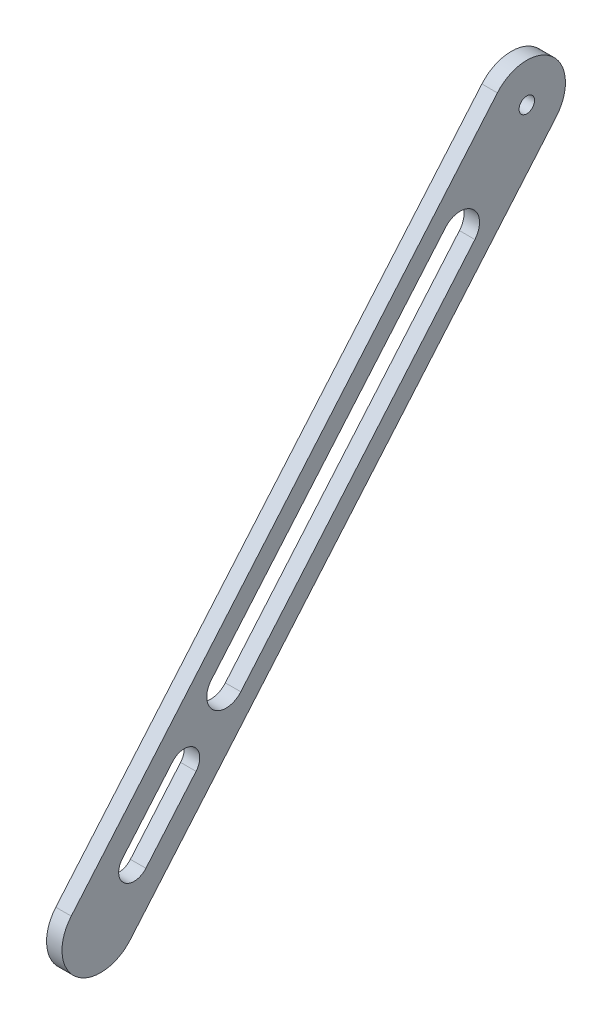
ISO-10303-21;
HEADER;
FILE_DESCRIPTION(('STEP AP214'),'2;1');
FILE_NAME('part.step','',(''),(''),'','','');
FILE_SCHEMA(('AUTOMOTIVE_DESIGN { 1 0 10303 214 1 1 1 1 }'));
ENDSEC;
DATA;
#1=APPLICATION_CONTEXT('core data for automotive mechanical design processes');
#2=APPLICATION_PROTOCOL_DEFINITION('international standard','automotive_design',2000,#1);
#3=PRODUCT_CONTEXT('',#1,'mechanical');
#4=PRODUCT('Part','Part','',(#3));
#5=PRODUCT_RELATED_PRODUCT_CATEGORY('part','',(#4));
#6=PRODUCT_DEFINITION_FORMATION('','',#4);
#7=PRODUCT_DEFINITION_CONTEXT('part definition',#1,'design');
#8=PRODUCT_DEFINITION('design','',#6,#7);
#9=PRODUCT_DEFINITION_SHAPE('','',#8);
#10=(LENGTH_UNIT() NAMED_UNIT(*) SI_UNIT(.MILLI.,.METRE.));
#11=(NAMED_UNIT(*) PLANE_ANGLE_UNIT() SI_UNIT($,.RADIAN.));
#12=(NAMED_UNIT(*) SI_UNIT($,.STERADIAN.) SOLID_ANGLE_UNIT());
#13=UNCERTAINTY_MEASURE_WITH_UNIT(LENGTH_MEASURE(1.E-05),#10,'distance_accuracy_value','');
#14=(GEOMETRIC_REPRESENTATION_CONTEXT(3) GLOBAL_UNCERTAINTY_ASSIGNED_CONTEXT((#13)) GLOBAL_UNIT_ASSIGNED_CONTEXT((#10,
#11,#12)) REPRESENTATION_CONTEXT('',''));
#15=CARTESIAN_POINT('',(0.,0.,0.));
#16=DIRECTION('',(0.,0.,1.));
#17=DIRECTION('',(1.,0.,0.));
#18=AXIS2_PLACEMENT_3D('',#15,#16,#17);
#19=CARTESIAN_POINT('',(3.,15.4,163.392394717891));
#20=DIRECTION('',(1.,0.,0.));
#21=DIRECTION('',(0.,0.,-1.));
#22=AXIS2_PLACEMENT_3D('',#19,#20,#21);
#23=PLANE('',#22);
#24=DIRECTION('',(0.,0.761030890619846,-0.648715641496615));
#25=VECTOR('',#24,1.);
#26=CARTESIAN_POINT('',(3.,94.7781370860257,90.8015974171766));
#27=LINE('',#26,#25);
#28=CARTESIAN_POINT('',(3.,41.5059747426321,136.211692321943));
#29=VERTEX_POINT('',#28);
#30=CARTESIAN_POINT('',(3.,94.7781370860257,90.8015974171766));
#31=VERTEX_POINT('',#30);
#32=EDGE_CURVE('E187',#29,#31,#27,.T.);
#33=ORIENTED_EDGE('',*,*,#32,.F.);
#34=CARTESIAN_POINT('',(3.,43.9386583982438,139.065558161767));
#35=DIRECTION('',(1.,0.,0.));
#36=DIRECTION('',(0.,0.,-1.));
#37=AXIS2_PLACEMENT_3D('',#34,#35,#36);
#38=CIRCLE('',#37,3.74999999999897);
#39=CARTESIAN_POINT('',(3.,46.3713420538555,141.919424001591));
#40=VERTEX_POINT('',#39);
#41=EDGE_CURVE('E184',#40,#29,#38,.T.);
#42=ORIENTED_EDGE('',*,*,#41,.F.);
#43=DIRECTION('',(0.,-0.761030890619871,0.648715641496585));
#44=VECTOR('',#43,1.);
#45=CARTESIAN_POINT('',(3.,99.6435043972514,96.5093290968253));
#46=LINE('',#45,#44);
#47=CARTESIAN_POINT('',(3.,99.6435043972514,96.5093290968253));
#48=VERTEX_POINT('',#47);
#49=EDGE_CURVE('E195',#48,#40,#46,.T.);
#50=ORIENTED_EDGE('',*,*,#49,.F.);
#51=CARTESIAN_POINT('',(3.,97.210820741638,93.6554632570015));
#52=DIRECTION('',(1.,0.,0.));
#53=DIRECTION('',(0.,0.,-1.));
#54=AXIS2_PLACEMENT_3D('',#51,#52,#53);
#55=CIRCLE('',#54,3.75000000000031);
#56=EDGE_CURVE('E191',#31,#48,#55,.T.);
#57=ORIENTED_EDGE('',*,*,#56,.F.);
#58=EDGE_LOOP('',(#33,#42,#50,#57));
#59=FACE_BOUND('',#58,.T.);
#60=CARTESIAN_POINT('',(3.,15.4,163.392394717891));
#61=DIRECTION('',(1.,0.,0.));
#62=DIRECTION('',(0.,0.,-1.));
#63=AXIS2_PLACEMENT_3D('',#60,#61,#62);
#64=CIRCLE('',#63,7.5);
#65=CARTESIAN_POINT('',(3.,20.2653673112247,169.100126397539));
#66=VERTEX_POINT('',#65);
#67=CARTESIAN_POINT('',(3.,10.5346326887753,157.684663038242));
#68=VERTEX_POINT('',#67);
#69=EDGE_CURVE('E227',#66,#68,#64,.T.);
#70=ORIENTED_EDGE('',*,*,#69,.T.);
#71=DIRECTION('',(0.,0.761030890619833,-0.64871564149663));
#72=VECTOR('',#71,1.);
#73=CARTESIAN_POINT('',(3.,107.503867446644,75.0264423185106));
#74=LINE('',#73,#72);
#75=CARTESIAN_POINT('',(3.,107.503867446644,75.0264423185106));
#76=VERTEX_POINT('',#75);
#77=EDGE_CURVE('E231',#68,#76,#74,.T.);
#78=ORIENTED_EDGE('',*,*,#77,.T.);
#79=CARTESIAN_POINT('',(3.,112.369234757868,80.7341739981593));
#80=DIRECTION('',(1.,0.,0.));
#81=DIRECTION('',(0.,0.,-1.));
#82=AXIS2_PLACEMENT_3D('',#79,#80,#81);
#83=CIRCLE('',#82,7.50000000000002);
#84=CARTESIAN_POINT('',(3.,117.234602069093,86.4419056778081));
#85=VERTEX_POINT('',#84);
#86=EDGE_CURVE('E235',#76,#85,#83,.T.);
#87=ORIENTED_EDGE('',*,*,#86,.T.);
#88=DIRECTION('',(0.,-0.761030890619833,0.648715641496629));
#89=VECTOR('',#88,1.);
#90=CARTESIAN_POINT('',(3.,117.234602069093,86.4419056778081));
#91=LINE('',#90,#89);
#92=EDGE_CURVE('E238',#85,#66,#91,.T.);
#93=ORIENTED_EDGE('',*,*,#92,.T.);
#94=EDGE_LOOP('',(#70,#78,#87,#93));
#95=FACE_BOUND('',#94,.T.);
#96=CARTESIAN_POINT('',(3.,112.369234757868,80.7341739981593));
#97=DIRECTION('',(1.,0.,0.));
#98=DIRECTION('',(0.,0.,-1.));
#99=AXIS2_PLACEMENT_3D('',#96,#97,#98);
#100=CIRCLE('',#99,1.4999999999999);
#101=CARTESIAN_POINT('',(3.,112.369234757868,79.2341739981595));
#102=VERTEX_POINT('',#101);
#103=EDGE_CURVE('E176',#102,#102,#100,.T.);
#104=ORIENTED_EDGE('',*,*,#103,.F.);
#105=EDGE_LOOP('',(#104));
#106=FACE_BOUND('',#105,.T.);
#107=DIRECTION('',(0.,-0.761030890619833,0.64871564149663));
#108=VECTOR('',#107,1.);
#109=CARTESIAN_POINT('',(3.,36.3719191899857,149.457596352334));
#110=LINE('',#109,#108);
#111=CARTESIAN_POINT('',(3.,36.3719191899857,149.457596352334));
#112=VERTEX_POINT('',#111);
#113=CARTESIAN_POINT('',(3.,24.9564558306882,159.188330974784));
#114=VERTEX_POINT('',#113);
#115=EDGE_CURVE('E136',#112,#114,#110,.T.);
#116=ORIENTED_EDGE('',*,*,#115,.F.);
#117=CARTESIAN_POINT('',(3.,34.4257722654958,147.174503680475));
#118=DIRECTION('',(1.,0.,0.));
#119=DIRECTION('',(0.,0.,-1.));
#120=AXIS2_PLACEMENT_3D('',#117,#118,#119);
#121=CIRCLE('',#120,2.99999999999998);
#122=CARTESIAN_POINT('',(3.,32.479625341006,144.891411008615));
#123=VERTEX_POINT('',#122);
#124=EDGE_CURVE('E127',#123,#112,#121,.T.);
#125=ORIENTED_EDGE('',*,*,#124,.F.);
#126=DIRECTION('',(0.,0.761030890619833,-0.64871564149663));
#127=VECTOR('',#126,1.);
#128=CARTESIAN_POINT('',(3.,32.479625341006,144.891411008615));
#129=LINE('',#128,#127);
#130=CARTESIAN_POINT('',(3.,21.0641619817085,154.622145631065));
#131=VERTEX_POINT('',#130);
#132=EDGE_CURVE('E154',#131,#123,#129,.T.);
#133=ORIENTED_EDGE('',*,*,#132,.F.);
#134=CARTESIAN_POINT('',(3.,23.0103089061984,156.905238302924));
#135=DIRECTION('',(1.,0.,0.));
#136=DIRECTION('',(0.,0.,-1.));
#137=AXIS2_PLACEMENT_3D('',#134,#135,#136);
#138=CIRCLE('',#137,2.99999999999998);
#139=EDGE_CURVE('E149',#114,#131,#138,.T.);
#140=ORIENTED_EDGE('',*,*,#139,.F.);
#141=EDGE_LOOP('',(#116,#125,#133,#140));
#142=FACE_BOUND('',#141,.T.);
#143=ADVANCED_FACE('F37',(#59,#95,#106,#142),#23,.T.);
#144=CARTESIAN_POINT('',(0.,15.4,163.392394717891));
#145=DIRECTION('',(1.,0.,0.));
#146=DIRECTION('',(0.,0.,-1.));
#147=AXIS2_PLACEMENT_3D('',#144,#145,#146);
#148=PLANE('',#147);
#149=CARTESIAN_POINT('',(0.,112.369234757868,80.7341739981593));
#150=DIRECTION('',(1.,0.,0.));
#151=DIRECTION('',(0.,0.,-1.));
#152=AXIS2_PLACEMENT_3D('',#149,#150,#151);
#153=CIRCLE('',#152,1.4999999999999);
#154=CARTESIAN_POINT('',(0.,112.369234757868,79.2341739981595));
#155=VERTEX_POINT('',#154);
#156=EDGE_CURVE('E145',#155,#155,#153,.T.);
#157=ORIENTED_EDGE('',*,*,#156,.T.);
#158=EDGE_LOOP('',(#157));
#159=FACE_BOUND('',#158,.T.);
#160=CARTESIAN_POINT('',(0.,43.9386583982438,139.065558161767));
#161=DIRECTION('',(1.,0.,0.));
#162=DIRECTION('',(0.,0.,-1.));
#163=AXIS2_PLACEMENT_3D('',#160,#161,#162);
#164=CIRCLE('',#163,3.74999999999897);
#165=CARTESIAN_POINT('',(0.,46.3713420538555,141.919424001591));
#166=VERTEX_POINT('',#165);
#167=CARTESIAN_POINT('',(0.,41.5059747426321,136.211692321943));
#168=VERTEX_POINT('',#167);
#169=EDGE_CURVE('E180',#166,#168,#164,.T.);
#170=ORIENTED_EDGE('',*,*,#169,.T.);
#171=DIRECTION('',(0.,0.761030890619846,-0.648715641496615));
#172=VECTOR('',#171,1.);
#173=CARTESIAN_POINT('',(0.,94.7781370860257,90.8015974171766));
#174=LINE('',#173,#172);
#175=CARTESIAN_POINT('',(0.,94.7781370860257,90.8015974171766));
#176=VERTEX_POINT('',#175);
#177=EDGE_CURVE('E202',#168,#176,#174,.T.);
#178=ORIENTED_EDGE('',*,*,#177,.T.);
#179=CARTESIAN_POINT('',(0.,97.210820741638,93.6554632570015));
#180=DIRECTION('',(1.,0.,0.));
#181=DIRECTION('',(0.,0.,-1.));
#182=AXIS2_PLACEMENT_3D('',#179,#180,#181);
#183=CIRCLE('',#182,3.75000000000031);
#184=CARTESIAN_POINT('',(0.,99.6435043972514,96.5093290968253));
#185=VERTEX_POINT('',#184);
#186=EDGE_CURVE('E206',#176,#185,#183,.T.);
#187=ORIENTED_EDGE('',*,*,#186,.T.);
#188=DIRECTION('',(0.,-0.761030890619871,0.648715641496585));
#189=VECTOR('',#188,1.);
#190=CARTESIAN_POINT('',(0.,99.6435043972514,96.5093290968253));
#191=LINE('',#190,#189);
#192=EDGE_CURVE('E188',#185,#166,#191,.T.);
#193=ORIENTED_EDGE('',*,*,#192,.T.);
#194=EDGE_LOOP('',(#170,#178,#187,#193));
#195=FACE_BOUND('',#194,.T.);
#196=CARTESIAN_POINT('',(0.,15.4,163.392394717891));
#197=DIRECTION('',(1.,0.,0.));
#198=DIRECTION('',(0.,0.,-1.));
#199=AXIS2_PLACEMENT_3D('',#196,#197,#198);
#200=CIRCLE('',#199,7.5);
#201=CARTESIAN_POINT('',(0.,20.2653673112247,169.100126397539));
#202=VERTEX_POINT('',#201);
#203=CARTESIAN_POINT('',(0.,10.5346326887753,157.684663038242));
#204=VERTEX_POINT('',#203);
#205=EDGE_CURVE('E226',#202,#204,#200,.T.);
#206=ORIENTED_EDGE('',*,*,#205,.F.);
#207=DIRECTION('',(0.,-0.761030890619833,0.648715641496629));
#208=VECTOR('',#207,1.);
#209=CARTESIAN_POINT('',(0.,117.234602069093,86.4419056778081));
#210=LINE('',#209,#208);
#211=CARTESIAN_POINT('',(0.,117.234602069093,86.4419056778081));
#212=VERTEX_POINT('',#211);
#213=EDGE_CURVE('E232',#212,#202,#210,.T.);
#214=ORIENTED_EDGE('',*,*,#213,.F.);
#215=CARTESIAN_POINT('',(0.,112.369234757868,80.7341739981593));
#216=DIRECTION('',(1.,0.,0.));
#217=DIRECTION('',(0.,0.,-1.));
#218=AXIS2_PLACEMENT_3D('',#215,#216,#217);
#219=CIRCLE('',#218,7.50000000000002);
#220=CARTESIAN_POINT('',(0.,107.503867446644,75.0264423185106));
#221=VERTEX_POINT('',#220);
#222=EDGE_CURVE('E248',#221,#212,#219,.T.);
#223=ORIENTED_EDGE('',*,*,#222,.F.);
#224=DIRECTION('',(0.,0.761030890619833,-0.64871564149663));
#225=VECTOR('',#224,1.);
#226=CARTESIAN_POINT('',(0.,107.503867446644,75.0264423185106));
#227=LINE('',#226,#225);
#228=EDGE_CURVE('E245',#204,#221,#227,.T.);
#229=ORIENTED_EDGE('',*,*,#228,.F.);
#230=EDGE_LOOP('',(#206,#214,#223,#229));
#231=FACE_BOUND('',#230,.T.);
#232=CARTESIAN_POINT('',(0.,34.4257722654958,147.174503680475));
#233=DIRECTION('',(1.,0.,0.));
#234=DIRECTION('',(0.,0.,-1.));
#235=AXIS2_PLACEMENT_3D('',#232,#233,#234);
#236=CIRCLE('',#235,2.99999999999998);
#237=CARTESIAN_POINT('',(0.,32.479625341006,144.891411008615));
#238=VERTEX_POINT('',#237);
#239=CARTESIAN_POINT('',(0.,36.3719191899857,149.457596352334));
#240=VERTEX_POINT('',#239);
#241=EDGE_CURVE('E61',#238,#240,#236,.T.);
#242=ORIENTED_EDGE('',*,*,#241,.T.);
#243=DIRECTION('',(0.,-0.761030890619833,0.64871564149663));
#244=VECTOR('',#243,1.);
#245=CARTESIAN_POINT('',(0.,36.3719191899857,149.457596352334));
#246=LINE('',#245,#244);
#247=CARTESIAN_POINT('',(0.,24.9564558306882,159.188330974784));
#248=VERTEX_POINT('',#247);
#249=EDGE_CURVE('E143',#240,#248,#246,.T.);
#250=ORIENTED_EDGE('',*,*,#249,.T.);
#251=CARTESIAN_POINT('',(0.,23.0103089061984,156.905238302924));
#252=DIRECTION('',(1.,0.,0.));
#253=DIRECTION('',(0.,0.,-1.));
#254=AXIS2_PLACEMENT_3D('',#251,#252,#253);
#255=CIRCLE('',#254,2.99999999999998);
#256=CARTESIAN_POINT('',(0.,21.0641619817085,154.622145631065));
#257=VERTEX_POINT('',#256);
#258=EDGE_CURVE('E163',#248,#257,#255,.T.);
#259=ORIENTED_EDGE('',*,*,#258,.T.);
#260=DIRECTION('',(0.,0.761030890619833,-0.64871564149663));
#261=VECTOR('',#260,1.);
#262=CARTESIAN_POINT('',(0.,32.479625341006,144.891411008615));
#263=LINE('',#262,#261);
#264=EDGE_CURVE('E137',#257,#238,#263,.T.);
#265=ORIENTED_EDGE('',*,*,#264,.T.);
#266=EDGE_LOOP('',(#242,#250,#259,#265));
#267=FACE_BOUND('',#266,.T.);
#268=ADVANCED_FACE('F272',(#159,#195,#231,#267),#148,.F.);
#269=CARTESIAN_POINT('',(3.,15.4,163.392394717891));
#270=DIRECTION('',(-1.,0.,0.));
#271=DIRECTION('',(0.,0.,1.));
#272=AXIS2_PLACEMENT_3D('',#269,#270,#271);
#273=CYLINDRICAL_SURFACE('',#272,7.5);
#274=ORIENTED_EDGE('',*,*,#205,.T.);
#275=DIRECTION('',(-1.,0.,0.));
#276=VECTOR('',#275,1.);
#277=CARTESIAN_POINT('',(3.,10.5346326887753,157.684663038242));
#278=LINE('',#277,#276);
#279=EDGE_CURVE('E11',#68,#204,#278,.T.);
#280=ORIENTED_EDGE('',*,*,#279,.F.);
#281=ORIENTED_EDGE('',*,*,#69,.F.);
#282=DIRECTION('',(-1.,0.,0.));
#283=VECTOR('',#282,1.);
#284=CARTESIAN_POINT('',(3.,20.2653673112247,169.100126397539));
#285=LINE('',#284,#283);
#286=EDGE_CURVE('E241',#66,#202,#285,.T.);
#287=ORIENTED_EDGE('',*,*,#286,.T.);
#288=EDGE_LOOP('',(#274,#280,#281,#287));
#289=FACE_BOUND('',#288,.T.);
#290=ADVANCED_FACE('F39',(#289),#273,.T.);
#291=CARTESIAN_POINT('',(3.,107.503867446644,75.0264423185106));
#292=DIRECTION('',(0.,0.64871564149663,0.761030890619833));
#293=DIRECTION('',(0.,-0.761030890619833,0.64871564149663));
#294=AXIS2_PLACEMENT_3D('',#291,#292,#293);
#295=PLANE('',#294);
#296=ORIENTED_EDGE('',*,*,#228,.T.);
#297=DIRECTION('',(-1.,0.,0.));
#298=VECTOR('',#297,1.);
#299=CARTESIAN_POINT('',(3.,107.503867446644,75.0264423185106));
#300=LINE('',#299,#298);
#301=EDGE_CURVE('E46',#76,#221,#300,.T.);
#302=ORIENTED_EDGE('',*,*,#301,.F.);
#303=ORIENTED_EDGE('',*,*,#77,.F.);
#304=ORIENTED_EDGE('',*,*,#279,.T.);
#305=EDGE_LOOP('',(#296,#302,#303,#304));
#306=FACE_BOUND('',#305,.T.);
#307=ADVANCED_FACE('F283',(#306),#295,.F.);
#308=CARTESIAN_POINT('',(3.,112.369234757868,80.7341739981593));
#309=DIRECTION('',(-1.,0.,0.));
#310=DIRECTION('',(0.,0.,1.));
#311=AXIS2_PLACEMENT_3D('',#308,#309,#310);
#312=CYLINDRICAL_SURFACE('',#311,7.50000000000002);
#313=ORIENTED_EDGE('',*,*,#222,.T.);
#314=DIRECTION('',(-1.,0.,0.));
#315=VECTOR('',#314,1.);
#316=CARTESIAN_POINT('',(3.,117.234602069093,86.4419056778081));
#317=LINE('',#316,#315);
#318=EDGE_CURVE('E256',#85,#212,#317,.T.);
#319=ORIENTED_EDGE('',*,*,#318,.F.);
#320=ORIENTED_EDGE('',*,*,#86,.F.);
#321=ORIENTED_EDGE('',*,*,#301,.T.);
#322=EDGE_LOOP('',(#313,#319,#320,#321));
#323=FACE_BOUND('',#322,.T.);
#324=ADVANCED_FACE('F266',(#323),#312,.T.);
#325=CARTESIAN_POINT('',(3.,117.234602069093,86.4419056778081));
#326=DIRECTION('',(0.,-0.648715641496629,-0.761030890619833));
#327=DIRECTION('',(0.,0.761030890619833,-0.648715641496629));
#328=AXIS2_PLACEMENT_3D('',#325,#326,#327);
#329=PLANE('',#328);
#330=ORIENTED_EDGE('',*,*,#213,.T.);
#331=ORIENTED_EDGE('',*,*,#286,.F.);
#332=ORIENTED_EDGE('',*,*,#92,.F.);
#333=ORIENTED_EDGE('',*,*,#318,.T.);
#334=EDGE_LOOP('',(#330,#331,#332,#333));
#335=FACE_BOUND('',#334,.T.);
#336=ADVANCED_FACE('F276',(#335),#329,.F.);
#337=CARTESIAN_POINT('',(3.,43.9386583982438,139.065558161767));
#338=DIRECTION('',(-1.,0.,0.));
#339=DIRECTION('',(0.,0.,1.));
#340=AXIS2_PLACEMENT_3D('',#337,#338,#339);
#341=CYLINDRICAL_SURFACE('',#340,3.74999999999897);
#342=ORIENTED_EDGE('',*,*,#169,.F.);
#343=DIRECTION('',(-1.,0.,0.));
#344=VECTOR('',#343,1.);
#345=CARTESIAN_POINT('',(3.,46.3713420538555,141.919424001591));
#346=LINE('',#345,#344);
#347=EDGE_CURVE('E198',#40,#166,#346,.T.);
#348=ORIENTED_EDGE('',*,*,#347,.F.);
#349=ORIENTED_EDGE('',*,*,#41,.T.);
#350=DIRECTION('',(-1.,0.,0.));
#351=VECTOR('',#350,1.);
#352=CARTESIAN_POINT('',(3.,41.5059747426321,136.211692321943));
#353=LINE('',#352,#351);
#354=EDGE_CURVE('E222',#29,#168,#353,.T.);
#355=ORIENTED_EDGE('',*,*,#354,.T.);
#356=EDGE_LOOP('',(#342,#348,#349,#355));
#357=FACE_BOUND('',#356,.T.);
#358=ADVANCED_FACE('F300',(#357),#341,.F.);
#359=CARTESIAN_POINT('',(3.,94.7781370860257,90.8015974171766));
#360=DIRECTION('',(0.,0.648715641496614,0.761030890619846));
#361=DIRECTION('',(0.,-0.761030890619846,0.648715641496615));
#362=AXIS2_PLACEMENT_3D('',#359,#360,#361);
#363=PLANE('',#362);
#364=ORIENTED_EDGE('',*,*,#177,.F.);
#365=ORIENTED_EDGE('',*,*,#354,.F.);
#366=ORIENTED_EDGE('',*,*,#32,.T.);
#367=DIRECTION('',(-1.,0.,0.));
#368=VECTOR('',#367,1.);
#369=CARTESIAN_POINT('',(3.,94.7781370860257,90.8015974171766));
#370=LINE('',#369,#368);
#371=EDGE_CURVE('E219',#31,#176,#370,.T.);
#372=ORIENTED_EDGE('',*,*,#371,.T.);
#373=EDGE_LOOP('',(#364,#365,#366,#372));
#374=FACE_BOUND('',#373,.T.);
#375=ADVANCED_FACE('F307',(#374),#363,.T.);
#376=CARTESIAN_POINT('',(3.,97.210820741638,93.6554632570015));
#377=DIRECTION('',(-1.,0.,0.));
#378=DIRECTION('',(0.,0.,1.));
#379=AXIS2_PLACEMENT_3D('',#376,#377,#378);
#380=CYLINDRICAL_SURFACE('',#379,3.75000000000031);
#381=ORIENTED_EDGE('',*,*,#186,.F.);
#382=ORIENTED_EDGE('',*,*,#371,.F.);
#383=ORIENTED_EDGE('',*,*,#56,.T.);
#384=DIRECTION('',(-1.,0.,0.));
#385=VECTOR('',#384,1.);
#386=CARTESIAN_POINT('',(3.,99.6435043972514,96.5093290968253));
#387=LINE('',#386,#385);
#388=EDGE_CURVE('E216',#48,#185,#387,.T.);
#389=ORIENTED_EDGE('',*,*,#388,.T.);
#390=EDGE_LOOP('',(#381,#382,#383,#389));
#391=FACE_BOUND('',#390,.T.);
#392=ADVANCED_FACE('F312',(#391),#380,.F.);
#393=CARTESIAN_POINT('',(3.,99.6435043972514,96.5093290968253));
#394=DIRECTION('',(0.,-0.648715641496585,-0.761030890619871));
#395=DIRECTION('',(0.,0.761030890619871,-0.648715641496585));
#396=AXIS2_PLACEMENT_3D('',#393,#394,#395);
#397=PLANE('',#396);
#398=ORIENTED_EDGE('',*,*,#192,.F.);
#399=ORIENTED_EDGE('',*,*,#388,.F.);
#400=ORIENTED_EDGE('',*,*,#49,.T.);
#401=ORIENTED_EDGE('',*,*,#347,.T.);
#402=EDGE_LOOP('',(#398,#399,#400,#401));
#403=FACE_BOUND('',#402,.T.);
#404=ADVANCED_FACE('F320',(#403),#397,.T.);
#405=CARTESIAN_POINT('',(3.,112.369234757868,80.7341739981593));
#406=DIRECTION('',(-1.,0.,0.));
#407=DIRECTION('',(0.,0.,1.));
#408=AXIS2_PLACEMENT_3D('',#405,#406,#407);
#409=CYLINDRICAL_SURFACE('',#408,1.4999999999999);
#410=ORIENTED_EDGE('',*,*,#103,.T.);
#411=EDGE_LOOP('',(#410));
#412=FACE_BOUND('',#411,.T.);
#413=ORIENTED_EDGE('',*,*,#156,.F.);
#414=EDGE_LOOP('',(#413));
#415=FACE_BOUND('',#414,.T.);
#416=ADVANCED_FACE('F331',(#412,#415),#409,.F.);
#417=CARTESIAN_POINT('',(3.,34.4257722654958,147.174503680475));
#418=DIRECTION('',(-1.,0.,0.));
#419=DIRECTION('',(0.,0.,1.));
#420=AXIS2_PLACEMENT_3D('',#417,#418,#419);
#421=CYLINDRICAL_SURFACE('',#420,2.99999999999998);
#422=ORIENTED_EDGE('',*,*,#241,.F.);
#423=DIRECTION('',(-1.,0.,0.));
#424=VECTOR('',#423,1.);
#425=CARTESIAN_POINT('',(3.,32.479625341006,144.891411008615));
#426=LINE('',#425,#424);
#427=EDGE_CURVE('E131',#123,#238,#426,.T.);
#428=ORIENTED_EDGE('',*,*,#427,.F.);
#429=ORIENTED_EDGE('',*,*,#124,.T.);
#430=DIRECTION('',(-1.,0.,0.));
#431=VECTOR('',#430,1.);
#432=CARTESIAN_POINT('',(3.,36.3719191899857,149.457596352334));
#433=LINE('',#432,#431);
#434=EDGE_CURVE('E130',#112,#240,#433,.T.);
#435=ORIENTED_EDGE('',*,*,#434,.T.);
#436=EDGE_LOOP('',(#422,#428,#429,#435));
#437=FACE_BOUND('',#436,.T.);
#438=ADVANCED_FACE('F129',(#437),#421,.F.);
#439=CARTESIAN_POINT('',(3.,36.3719191899857,149.457596352334));
#440=DIRECTION('',(0.,-0.64871564149663,-0.761030890619833));
#441=DIRECTION('',(0.,0.761030890619833,-0.64871564149663));
#442=AXIS2_PLACEMENT_3D('',#439,#440,#441);
#443=PLANE('',#442);
#444=ORIENTED_EDGE('',*,*,#249,.F.);
#445=ORIENTED_EDGE('',*,*,#434,.F.);
#446=ORIENTED_EDGE('',*,*,#115,.T.);
#447=DIRECTION('',(-1.,0.,0.));
#448=VECTOR('',#447,1.);
#449=CARTESIAN_POINT('',(3.,24.9564558306882,159.188330974784));
#450=LINE('',#449,#448);
#451=EDGE_CURVE('E146',#114,#248,#450,.T.);
#452=ORIENTED_EDGE('',*,*,#451,.T.);
#453=EDGE_LOOP('',(#444,#445,#446,#452));
#454=FACE_BOUND('',#453,.T.);
#455=ADVANCED_FACE('F140',(#454),#443,.T.);
#456=CARTESIAN_POINT('',(3.,23.0103089061984,156.905238302924));
#457=DIRECTION('',(-1.,0.,0.));
#458=DIRECTION('',(0.,0.,1.));
#459=AXIS2_PLACEMENT_3D('',#456,#457,#458);
#460=CYLINDRICAL_SURFACE('',#459,2.99999999999998);
#461=ORIENTED_EDGE('',*,*,#258,.F.);
#462=ORIENTED_EDGE('',*,*,#451,.F.);
#463=ORIENTED_EDGE('',*,*,#139,.T.);
#464=DIRECTION('',(-1.,0.,0.));
#465=VECTOR('',#464,1.);
#466=CARTESIAN_POINT('',(3.,21.0641619817085,154.622145631065));
#467=LINE('',#466,#465);
#468=EDGE_CURVE('E53',#131,#257,#467,.T.);
#469=ORIENTED_EDGE('',*,*,#468,.T.);
#470=EDGE_LOOP('',(#461,#462,#463,#469));
#471=FACE_BOUND('',#470,.T.);
#472=ADVANCED_FACE('F341',(#471),#460,.F.);
#473=CARTESIAN_POINT('',(3.,32.479625341006,144.891411008615));
#474=DIRECTION('',(0.,0.64871564149663,0.761030890619833));
#475=DIRECTION('',(0.,-0.761030890619833,0.64871564149663));
#476=AXIS2_PLACEMENT_3D('',#473,#474,#475);
#477=PLANE('',#476);
#478=ORIENTED_EDGE('',*,*,#264,.F.);
#479=ORIENTED_EDGE('',*,*,#468,.F.);
#480=ORIENTED_EDGE('',*,*,#132,.T.);
#481=ORIENTED_EDGE('',*,*,#427,.T.);
#482=EDGE_LOOP('',(#478,#479,#480,#481));
#483=FACE_BOUND('',#482,.T.);
#484=ADVANCED_FACE('F344',(#483),#477,.T.);
#485=CLOSED_SHELL('',(#143,#268,#290,#307,#324,#336,#358,#375,#392,#404,#416,#438,#455,#472,#484));
#486=MANIFOLD_SOLID_BREP('B2',#485);
#487=ADVANCED_BREP_SHAPE_REPRESENTATION('',(#18,#486),#14);
#488=SHAPE_DEFINITION_REPRESENTATION(#9,#487);
ENDSEC;
END-ISO-10303-21;
